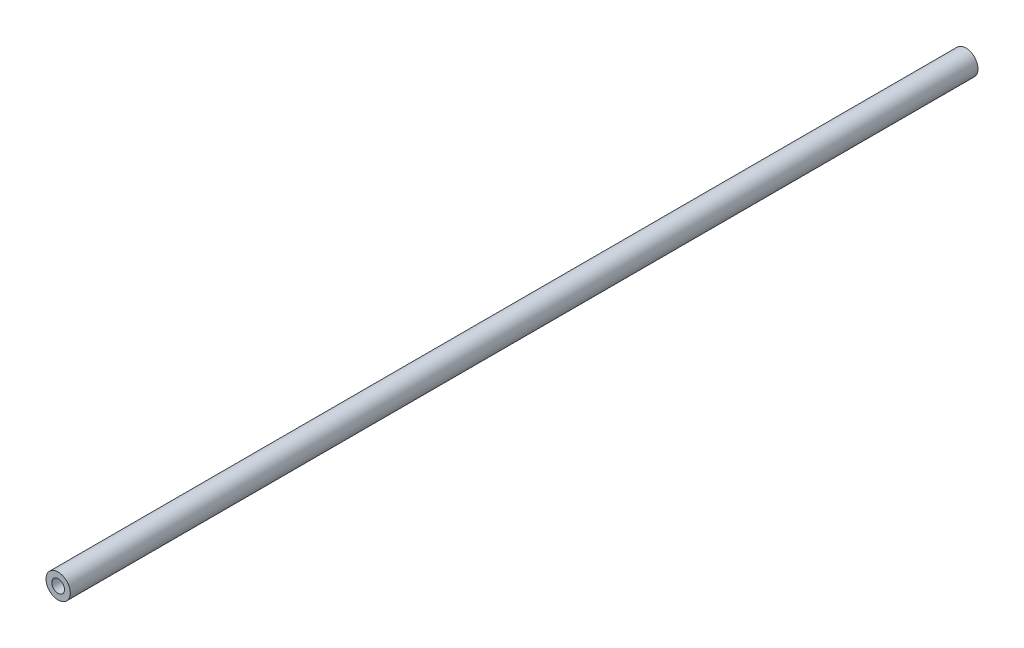
ISO-10303-21;
HEADER;
FILE_DESCRIPTION(('STEP AP214'),'2;1');
FILE_NAME('part.step','',(''),(''),'','','');
FILE_SCHEMA(('AUTOMOTIVE_DESIGN { 1 0 10303 214 1 1 1 1 }'));
ENDSEC;
DATA;
#1=APPLICATION_CONTEXT('core data for automotive mechanical design processes');
#2=APPLICATION_PROTOCOL_DEFINITION('international standard','automotive_design',2000,#1);
#3=PRODUCT_CONTEXT('',#1,'mechanical');
#4=PRODUCT('Part','Part','',(#3));
#5=PRODUCT_RELATED_PRODUCT_CATEGORY('part','',(#4));
#6=PRODUCT_DEFINITION_FORMATION('','',#4);
#7=PRODUCT_DEFINITION_CONTEXT('part definition',#1,'design');
#8=PRODUCT_DEFINITION('design','',#6,#7);
#9=PRODUCT_DEFINITION_SHAPE('','',#8);
#10=(LENGTH_UNIT() NAMED_UNIT(*) SI_UNIT(.MILLI.,.METRE.));
#11=(NAMED_UNIT(*) PLANE_ANGLE_UNIT() SI_UNIT($,.RADIAN.));
#12=(NAMED_UNIT(*) SI_UNIT($,.STERADIAN.) SOLID_ANGLE_UNIT());
#13=UNCERTAINTY_MEASURE_WITH_UNIT(LENGTH_MEASURE(1.E-05),#10,'distance_accuracy_value','');
#14=(GEOMETRIC_REPRESENTATION_CONTEXT(3) GLOBAL_UNCERTAINTY_ASSIGNED_CONTEXT((#13)) GLOBAL_UNIT_ASSIGNED_CONTEXT((#10,
#11,#12)) REPRESENTATION_CONTEXT('',''));
#15=CARTESIAN_POINT('',(0.,0.,0.));
#16=DIRECTION('',(0.,0.,1.));
#17=DIRECTION('',(1.,0.,0.));
#18=AXIS2_PLACEMENT_3D('',#15,#16,#17);
#19=CARTESIAN_POINT('',(0.,0.,177.8));
#20=DIRECTION('',(0.,0.,1.));
#21=DIRECTION('',(1.,0.,0.));
#22=AXIS2_PLACEMENT_3D('',#19,#20,#21);
#23=PLANE('',#22);
#24=CARTESIAN_POINT('',(0.,0.,177.8));
#25=DIRECTION('',(0.,0.,1.));
#26=DIRECTION('',(1.,0.,0.));
#27=AXIS2_PLACEMENT_3D('',#24,#25,#26);
#28=CIRCLE('',#27,4.7625);
#29=CARTESIAN_POINT('',(4.7625,0.,177.8));
#30=VERTEX_POINT('',#29);
#31=EDGE_CURVE('E10',#30,#30,#28,.T.);
#32=ORIENTED_EDGE('',*,*,#31,.T.);
#33=EDGE_LOOP('',(#32));
#34=FACE_BOUND('',#33,.T.);
#35=CARTESIAN_POINT('',(0.,0.,177.8));
#36=DIRECTION('',(0.,0.,1.));
#37=DIRECTION('',(1.,0.,0.));
#38=AXIS2_PLACEMENT_3D('',#35,#36,#37);
#39=CIRCLE('',#38,2.4892);
#40=CARTESIAN_POINT('',(2.4892,0.,177.8));
#41=VERTEX_POINT('',#40);
#42=EDGE_CURVE('E51',#41,#41,#39,.T.);
#43=ORIENTED_EDGE('',*,*,#42,.F.);
#44=EDGE_LOOP('',(#43));
#45=FACE_BOUND('',#44,.T.);
#46=ADVANCED_FACE('F37',(#34,#45),#23,.T.);
#47=CARTESIAN_POINT('',(0.,0.,-177.8));
#48=DIRECTION('',(0.,0.,1.));
#49=DIRECTION('',(1.,0.,0.));
#50=AXIS2_PLACEMENT_3D('',#47,#48,#49);
#51=PLANE('',#50);
#52=CARTESIAN_POINT('',(0.,0.,-177.8));
#53=DIRECTION('',(0.,0.,1.));
#54=DIRECTION('',(1.,0.,0.));
#55=AXIS2_PLACEMENT_3D('',#52,#53,#54);
#56=CIRCLE('',#55,4.7625);
#57=CARTESIAN_POINT('',(4.7625,0.,-177.8));
#58=VERTEX_POINT('',#57);
#59=EDGE_CURVE('E41',#58,#58,#56,.T.);
#60=ORIENTED_EDGE('',*,*,#59,.F.);
#61=EDGE_LOOP('',(#60));
#62=FACE_BOUND('',#61,.T.);
#63=CARTESIAN_POINT('',(0.,0.,-177.8));
#64=DIRECTION('',(0.,0.,1.));
#65=DIRECTION('',(1.,0.,0.));
#66=AXIS2_PLACEMENT_3D('',#63,#64,#65);
#67=CIRCLE('',#66,2.4892);
#68=CARTESIAN_POINT('',(2.4892,0.,-177.8));
#69=VERTEX_POINT('',#68);
#70=EDGE_CURVE('E53',#69,#69,#67,.T.);
#71=ORIENTED_EDGE('',*,*,#70,.T.);
#72=EDGE_LOOP('',(#71));
#73=FACE_BOUND('',#72,.T.);
#74=ADVANCED_FACE('F66',(#62,#73),#51,.F.);
#75=CARTESIAN_POINT('',(0.,0.,177.8));
#76=DIRECTION('',(0.,0.,-1.));
#77=DIRECTION('',(-1.,0.,0.));
#78=AXIS2_PLACEMENT_3D('',#75,#76,#77);
#79=CYLINDRICAL_SURFACE('',#78,4.7625);
#80=ORIENTED_EDGE('',*,*,#31,.F.);
#81=EDGE_LOOP('',(#80));
#82=FACE_BOUND('',#81,.T.);
#83=ORIENTED_EDGE('',*,*,#59,.T.);
#84=EDGE_LOOP('',(#83));
#85=FACE_BOUND('',#84,.T.);
#86=ADVANCED_FACE('F39',(#82,#85),#79,.T.);
#87=CARTESIAN_POINT('',(0.,0.,177.8));
#88=DIRECTION('',(0.,0.,-1.));
#89=DIRECTION('',(-1.,0.,0.));
#90=AXIS2_PLACEMENT_3D('',#87,#88,#89);
#91=CYLINDRICAL_SURFACE('',#90,2.4892);
#92=ORIENTED_EDGE('',*,*,#42,.T.);
#93=EDGE_LOOP('',(#92));
#94=FACE_BOUND('',#93,.T.);
#95=ORIENTED_EDGE('',*,*,#70,.F.);
#96=EDGE_LOOP('',(#95));
#97=FACE_BOUND('',#96,.T.);
#98=ADVANCED_FACE('F62',(#94,#97),#91,.F.);
#99=CLOSED_SHELL('',(#46,#74,#86,#98));
#100=MANIFOLD_SOLID_BREP('B2',#99);
#101=ADVANCED_BREP_SHAPE_REPRESENTATION('',(#18,#100),#14);
#102=SHAPE_DEFINITION_REPRESENTATION(#9,#101);
ENDSEC;
END-ISO-10303-21;
